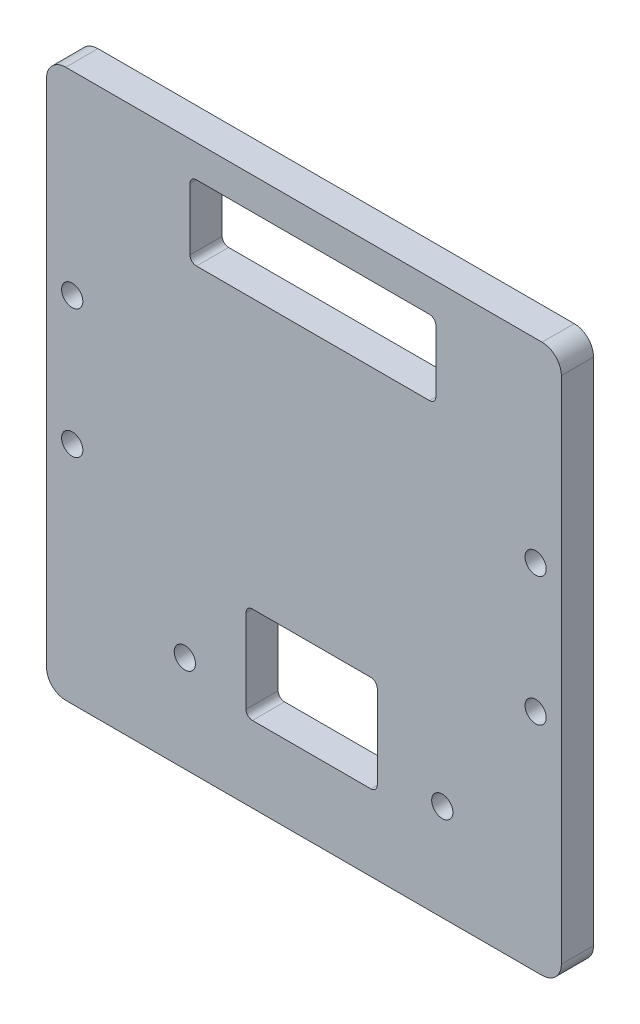
ISO-10303-21;
HEADER;
FILE_DESCRIPTION(('STEP AP214'),'2;1');
FILE_NAME('part.step','',(''),(''),'','','');
FILE_SCHEMA(('AUTOMOTIVE_DESIGN { 1 0 10303 214 1 1 1 1 }'));
ENDSEC;
DATA;
#1=APPLICATION_CONTEXT('core data for automotive mechanical design processes');
#2=APPLICATION_PROTOCOL_DEFINITION('international standard','automotive_design',2000,#1);
#3=PRODUCT_CONTEXT('',#1,'mechanical');
#4=PRODUCT('Part','Part','',(#3));
#5=PRODUCT_RELATED_PRODUCT_CATEGORY('part','',(#4));
#6=PRODUCT_DEFINITION_FORMATION('','',#4);
#7=PRODUCT_DEFINITION_CONTEXT('part definition',#1,'design');
#8=PRODUCT_DEFINITION('design','',#6,#7);
#9=PRODUCT_DEFINITION_SHAPE('','',#8);
#10=(LENGTH_UNIT() NAMED_UNIT(*) SI_UNIT(.MILLI.,.METRE.));
#11=(NAMED_UNIT(*) PLANE_ANGLE_UNIT() SI_UNIT($,.RADIAN.));
#12=(NAMED_UNIT(*) SI_UNIT($,.STERADIAN.) SOLID_ANGLE_UNIT());
#13=UNCERTAINTY_MEASURE_WITH_UNIT(LENGTH_MEASURE(1.E-05),#10,'distance_accuracy_value','');
#14=(GEOMETRIC_REPRESENTATION_CONTEXT(3) GLOBAL_UNCERTAINTY_ASSIGNED_CONTEXT((#13)) GLOBAL_UNIT_ASSIGNED_CONTEXT((#10,
#11,#12)) REPRESENTATION_CONTEXT('',''));
#15=CARTESIAN_POINT('',(0.,0.,0.));
#16=DIRECTION('',(0.,0.,1.));
#17=DIRECTION('',(1.,0.,0.));
#18=AXIS2_PLACEMENT_3D('',#15,#16,#17);
#19=CARTESIAN_POINT('',(0.,0.,43.4989056307904));
#20=DIRECTION('',(0.,0.,1.));
#21=DIRECTION('',(1.,0.,0.));
#22=AXIS2_PLACEMENT_3D('',#19,#20,#21);
#23=PLANE('',#22);
#24=CARTESIAN_POINT('',(16.7989221606857,40.7225688335815,43.4989056307904));
#25=DIRECTION('',(0.,0.,1.));
#26=DIRECTION('',(1.,0.,0.));
#27=AXIS2_PLACEMENT_3D('',#24,#25,#26);
#28=CIRCLE('',#27,1.65);
#29=CARTESIAN_POINT('',(18.4489221606857,40.7225688335815,43.4989056307904));
#30=VERTEX_POINT('',#29);
#31=EDGE_CURVE('E833',#30,#30,#28,.T.);
#32=ORIENTED_EDGE('',*,*,#31,.F.);
#33=EDGE_LOOP('',(#32));
#34=FACE_BOUND('',#33,.T.);
#35=CARTESIAN_POINT('',(-37.7010778393143,20.7225688335815,43.4989056307904));
#36=DIRECTION('',(0.,0.,1.));
#37=DIRECTION('',(1.,0.,0.));
#38=AXIS2_PLACEMENT_3D('',#35,#36,#37);
#39=CIRCLE('',#38,1.65);
#40=CARTESIAN_POINT('',(-36.0510778393143,20.7225688335815,43.4989056307904));
#41=VERTEX_POINT('',#40);
#42=EDGE_CURVE('E817',#41,#41,#39,.T.);
#43=ORIENTED_EDGE('',*,*,#42,.F.);
#44=EDGE_LOOP('',(#43));
#45=FACE_BOUND('',#44,.T.);
#46=CARTESIAN_POINT('',(-55.2010778393143,60.7225688335815,43.4989056307904));
#47=DIRECTION('',(0.,0.,1.));
#48=DIRECTION('',(1.,0.,0.));
#49=AXIS2_PLACEMENT_3D('',#46,#47,#48);
#50=CIRCLE('',#49,1.65);
#51=CARTESIAN_POINT('',(-53.5510778393143,60.7225688335815,43.4989056307904));
#52=VERTEX_POINT('',#51);
#53=EDGE_CURVE('E427',#52,#52,#50,.T.);
#54=ORIENTED_EDGE('',*,*,#53,.F.);
#55=EDGE_LOOP('',(#54));
#56=FACE_BOUND('',#55,.T.);
#57=DIRECTION('',(-1.,0.,0.));
#58=VECTOR('',#57,1.);
#59=CARTESIAN_POINT('',(-59.2010778393143,90.9225688335816,43.4989056307904));
#60=LINE('',#59,#58);
#61=CARTESIAN_POINT('',(17.7989221606857,90.9225688335816,43.4989056307904));
#62=VERTEX_POINT('',#61);
#63=CARTESIAN_POINT('',(-56.2010778393143,90.9225688335816,43.4989056307904));
#64=VERTEX_POINT('',#63);
#65=EDGE_CURVE('E245',#62,#64,#60,.T.);
#66=ORIENTED_EDGE('',*,*,#65,.T.);
#67=CARTESIAN_POINT('',(-56.2010778393143,87.9225688335816,43.4989056307904));
#68=DIRECTION('',(0.,0.,1.));
#69=DIRECTION('',(1.,0.,0.));
#70=AXIS2_PLACEMENT_3D('',#67,#68,#69);
#71=CIRCLE('',#70,3.);
#72=CARTESIAN_POINT('',(-59.2010778393143,87.9225688335816,43.4989056307904));
#73=VERTEX_POINT('',#72);
#74=EDGE_CURVE('E277',#64,#73,#71,.T.);
#75=ORIENTED_EDGE('',*,*,#74,.T.);
#76=DIRECTION('',(0.,-1.,0.));
#77=VECTOR('',#76,1.);
#78=CARTESIAN_POINT('',(-59.2010778393143,90.9225688335816,43.4989056307904));
#79=LINE('',#78,#77);
#80=CARTESIAN_POINT('',(-59.2010778393143,8.72256883358154,43.4989056307904));
#81=VERTEX_POINT('',#80);
#82=EDGE_CURVE('E224',#73,#81,#79,.T.);
#83=ORIENTED_EDGE('',*,*,#82,.T.);
#84=CARTESIAN_POINT('',(-56.2010778393143,8.72256883358153,43.4989056307904));
#85=DIRECTION('',(0.,0.,1.));
#86=DIRECTION('',(1.,0.,0.));
#87=AXIS2_PLACEMENT_3D('',#84,#85,#86);
#88=CIRCLE('',#87,3.);
#89=CARTESIAN_POINT('',(-56.2010778393143,5.72256883358153,43.4989056307904));
#90=VERTEX_POINT('',#89);
#91=EDGE_CURVE('E274',#81,#90,#88,.T.);
#92=ORIENTED_EDGE('',*,*,#91,.T.);
#93=DIRECTION('',(1.,0.,0.));
#94=VECTOR('',#93,1.);
#95=CARTESIAN_POINT('',(-59.2010778393143,5.72256883358153,43.4989056307904));
#96=LINE('',#95,#94);
#97=CARTESIAN_POINT('',(17.7989221606857,5.72256883358153,43.4989056307904));
#98=VERTEX_POINT('',#97);
#99=EDGE_CURVE('E461',#90,#98,#96,.T.);
#100=ORIENTED_EDGE('',*,*,#99,.T.);
#101=CARTESIAN_POINT('',(17.7989221606857,8.72256883358154,43.4989056307904));
#102=DIRECTION('',(0.,0.,1.));
#103=DIRECTION('',(1.,0.,0.));
#104=AXIS2_PLACEMENT_3D('',#101,#102,#103);
#105=CIRCLE('',#104,3.);
#106=CARTESIAN_POINT('',(20.7989221606857,8.72256883358154,43.4989056307904));
#107=VERTEX_POINT('',#106);
#108=EDGE_CURVE('E271',#98,#107,#105,.T.);
#109=ORIENTED_EDGE('',*,*,#108,.T.);
#110=DIRECTION('',(0.,1.,0.));
#111=VECTOR('',#110,1.);
#112=CARTESIAN_POINT('',(20.7989221606857,90.9225688335816,43.4989056307904));
#113=LINE('',#112,#111);
#114=CARTESIAN_POINT('',(20.7989221606857,87.9225688335816,43.4989056307904));
#115=VERTEX_POINT('',#114);
#116=EDGE_CURVE('E464',#107,#115,#113,.T.);
#117=ORIENTED_EDGE('',*,*,#116,.T.);
#118=CARTESIAN_POINT('',(17.7989221606857,87.9225688335816,43.4989056307904));
#119=DIRECTION('',(0.,0.,1.));
#120=DIRECTION('',(1.,0.,0.));
#121=AXIS2_PLACEMENT_3D('',#118,#119,#120);
#122=CIRCLE('',#121,3.);
#123=EDGE_CURVE('E268',#115,#62,#122,.T.);
#124=ORIENTED_EDGE('',*,*,#123,.T.);
#125=EDGE_LOOP('',(#66,#75,#83,#92,#100,#109,#117,#124));
#126=FACE_BOUND('',#125,.T.);
#127=DIRECTION('',(1.,0.,0.));
#128=VECTOR('',#127,1.);
#129=CARTESIAN_POINT('',(-28.2010778393143,17.5225688335815,43.4989056307904));
#130=LINE('',#129,#128);
#131=CARTESIAN_POINT('',(-27.2010778393143,17.5225688335815,43.4989056307904));
#132=VERTEX_POINT('',#131);
#133=CARTESIAN_POINT('',(-8.8010778393143,17.5225688335815,43.4989056307904));
#134=VERTEX_POINT('',#133);
#135=EDGE_CURVE('E437',#132,#134,#130,.T.);
#136=ORIENTED_EDGE('',*,*,#135,.F.);
#137=CARTESIAN_POINT('',(-27.2010778393143,18.5225688335815,43.4989056307904));
#138=DIRECTION('',(0.,0.,1.));
#139=DIRECTION('',(1.,0.,0.));
#140=AXIS2_PLACEMENT_3D('',#137,#138,#139);
#141=CIRCLE('',#140,1.);
#142=CARTESIAN_POINT('',(-28.2010778393143,18.5225688335815,43.4989056307904));
#143=VERTEX_POINT('',#142);
#144=EDGE_CURVE('E352',#132,#143,#141,.F.);
#145=ORIENTED_EDGE('',*,*,#144,.T.);
#146=DIRECTION('',(0.,-1.,0.));
#147=VECTOR('',#146,1.);
#148=CARTESIAN_POINT('',(-28.2010778393143,32.5225688335815,43.4989056307904));
#149=LINE('',#148,#147);
#150=CARTESIAN_POINT('',(-28.2010778393143,31.5225688335815,43.4989056307904));
#151=VERTEX_POINT('',#150);
#152=EDGE_CURVE('E433',#151,#143,#149,.T.);
#153=ORIENTED_EDGE('',*,*,#152,.F.);
#154=CARTESIAN_POINT('',(-27.2010778393143,31.5225688335815,43.4989056307904));
#155=DIRECTION('',(0.,0.,1.));
#156=DIRECTION('',(1.,0.,0.));
#157=AXIS2_PLACEMENT_3D('',#154,#155,#156);
#158=CIRCLE('',#157,1.);
#159=CARTESIAN_POINT('',(-27.2010778393143,32.5225688335815,43.4989056307904));
#160=VERTEX_POINT('',#159);
#161=EDGE_CURVE('E370',#151,#160,#158,.F.);
#162=ORIENTED_EDGE('',*,*,#161,.T.);
#163=DIRECTION('',(-1.,0.,0.));
#164=VECTOR('',#163,1.);
#165=CARTESIAN_POINT('',(-28.2010778393143,32.5225688335815,43.4989056307904));
#166=LINE('',#165,#164);
#167=CARTESIAN_POINT('',(-8.8010778393143,32.5225688335815,43.4989056307904));
#168=VERTEX_POINT('',#167);
#169=EDGE_CURVE('E234',#168,#160,#166,.T.);
#170=ORIENTED_EDGE('',*,*,#169,.F.);
#171=CARTESIAN_POINT('',(-8.8010778393143,31.5225688335815,43.4989056307904));
#172=DIRECTION('',(0.,0.,1.));
#173=DIRECTION('',(1.,0.,0.));
#174=AXIS2_PLACEMENT_3D('',#171,#172,#173);
#175=CIRCLE('',#174,1.);
#176=CARTESIAN_POINT('',(-7.80107783931429,31.5225688335815,43.4989056307904));
#177=VERTEX_POINT('',#176);
#178=EDGE_CURVE('E364',#168,#177,#175,.F.);
#179=ORIENTED_EDGE('',*,*,#178,.T.);
#180=DIRECTION('',(0.,1.,0.));
#181=VECTOR('',#180,1.);
#182=CARTESIAN_POINT('',(-7.80107783931429,32.5225688335815,43.4989056307904));
#183=LINE('',#182,#181);
#184=CARTESIAN_POINT('',(-7.80107783931429,18.5225688335815,43.4989056307904));
#185=VERTEX_POINT('',#184);
#186=EDGE_CURVE('E242',#185,#177,#183,.T.);
#187=ORIENTED_EDGE('',*,*,#186,.F.);
#188=CARTESIAN_POINT('',(-8.8010778393143,18.5225688335815,43.4989056307904));
#189=DIRECTION('',(0.,0.,1.));
#190=DIRECTION('',(1.,0.,0.));
#191=AXIS2_PLACEMENT_3D('',#188,#189,#190);
#192=CIRCLE('',#191,1.);
#193=EDGE_CURVE('E358',#185,#134,#192,.F.);
#194=ORIENTED_EDGE('',*,*,#193,.T.);
#195=EDGE_LOOP('',(#136,#145,#153,#162,#170,#179,#187,#194));
#196=FACE_BOUND('',#195,.T.);
#197=DIRECTION('',(1.,0.,0.));
#198=VECTOR('',#197,1.);
#199=CARTESIAN_POINT('',(-36.9010778393143,74.3225688335816,43.4989056307904));
#200=LINE('',#199,#198);
#201=CARTESIAN_POINT('',(-35.9010778393143,74.3225688335816,43.4989056307904));
#202=VERTEX_POINT('',#201);
#203=CARTESIAN_POINT('',(0.298922160685701,74.3225688335816,43.4989056307904));
#204=VERTEX_POINT('',#203);
#205=EDGE_CURVE('E412',#202,#204,#200,.T.);
#206=ORIENTED_EDGE('',*,*,#205,.F.);
#207=CARTESIAN_POINT('',(-35.9010778393143,75.3225688335816,43.4989056307904));
#208=DIRECTION('',(0.,0.,1.));
#209=DIRECTION('',(1.,0.,0.));
#210=AXIS2_PLACEMENT_3D('',#207,#208,#209);
#211=CIRCLE('',#210,1.);
#212=CARTESIAN_POINT('',(-36.9010778393143,75.3225688335816,43.4989056307904));
#213=VERTEX_POINT('',#212);
#214=EDGE_CURVE('E382',#202,#213,#211,.F.);
#215=ORIENTED_EDGE('',*,*,#214,.T.);
#216=DIRECTION('',(0.,-1.,0.));
#217=VECTOR('',#216,1.);
#218=CARTESIAN_POINT('',(-36.9010778393143,85.9225688335815,43.4989056307904));
#219=LINE('',#218,#217);
#220=CARTESIAN_POINT('',(-36.9010778393143,84.9225688335815,43.4989056307904));
#221=VERTEX_POINT('',#220);
#222=EDGE_CURVE('E405',#221,#213,#219,.T.);
#223=ORIENTED_EDGE('',*,*,#222,.F.);
#224=CARTESIAN_POINT('',(-35.9010778393143,84.9225688335815,43.4989056307904));
#225=DIRECTION('',(0.,0.,1.));
#226=DIRECTION('',(1.,0.,0.));
#227=AXIS2_PLACEMENT_3D('',#224,#225,#226);
#228=CIRCLE('',#227,1.);
#229=CARTESIAN_POINT('',(-35.9010778393143,85.9225688335815,43.4989056307904));
#230=VERTEX_POINT('',#229);
#231=EDGE_CURVE('E376',#221,#230,#228,.F.);
#232=ORIENTED_EDGE('',*,*,#231,.T.);
#233=DIRECTION('',(-1.,0.,0.));
#234=VECTOR('',#233,1.);
#235=CARTESIAN_POINT('',(-36.9010778393143,85.9225688335815,43.4989056307904));
#236=LINE('',#235,#234);
#237=CARTESIAN_POINT('',(0.298922160685694,85.9225688335816,43.4989056307904));
#238=VERTEX_POINT('',#237);
#239=EDGE_CURVE('E411',#238,#230,#236,.T.);
#240=ORIENTED_EDGE('',*,*,#239,.F.);
#241=CARTESIAN_POINT('',(0.298922160685695,84.9225688335816,43.4989056307904));
#242=DIRECTION('',(0.,0.,1.));
#243=DIRECTION('',(1.,0.,0.));
#244=AXIS2_PLACEMENT_3D('',#241,#242,#243);
#245=CIRCLE('',#244,1.);
#246=CARTESIAN_POINT('',(1.2989221606857,84.9225688335816,43.4989056307904));
#247=VERTEX_POINT('',#246);
#248=EDGE_CURVE('E11',#238,#247,#245,.F.);
#249=ORIENTED_EDGE('',*,*,#248,.T.);
#250=DIRECTION('',(0.,1.,0.));
#251=VECTOR('',#250,1.);
#252=CARTESIAN_POINT('',(1.29892216068569,85.9225688335816,43.4989056307904));
#253=LINE('',#252,#251);
#254=CARTESIAN_POINT('',(1.2989221606857,75.3225688335816,43.4989056307904));
#255=VERTEX_POINT('',#254);
#256=EDGE_CURVE('E408',#255,#247,#253,.T.);
#257=ORIENTED_EDGE('',*,*,#256,.F.);
#258=CARTESIAN_POINT('',(0.298922160685701,75.3225688335816,43.4989056307904));
#259=DIRECTION('',(0.,0.,1.));
#260=DIRECTION('',(1.,0.,0.));
#261=AXIS2_PLACEMENT_3D('',#258,#259,#260);
#262=CIRCLE('',#261,1.);
#263=EDGE_CURVE('E388',#255,#204,#262,.F.);
#264=ORIENTED_EDGE('',*,*,#263,.T.);
#265=EDGE_LOOP('',(#206,#215,#223,#232,#240,#249,#257,#264));
#266=FACE_BOUND('',#265,.T.);
#267=CARTESIAN_POINT('',(-55.2010778393143,40.7225688335815,43.4989056307904));
#268=DIRECTION('',(0.,0.,1.));
#269=DIRECTION('',(1.,0.,0.));
#270=AXIS2_PLACEMENT_3D('',#267,#268,#269);
#271=CIRCLE('',#270,1.65);
#272=CARTESIAN_POINT('',(-53.5510778393143,40.7225688335815,43.4989056307904));
#273=VERTEX_POINT('',#272);
#274=EDGE_CURVE('E809',#273,#273,#271,.T.);
#275=ORIENTED_EDGE('',*,*,#274,.F.);
#276=EDGE_LOOP('',(#275));
#277=FACE_BOUND('',#276,.T.);
#278=CARTESIAN_POINT('',(2.2989221606857,20.7225688335815,43.4989056307904));
#279=DIRECTION('',(0.,0.,1.));
#280=DIRECTION('',(1.,0.,0.));
#281=AXIS2_PLACEMENT_3D('',#278,#279,#280);
#282=CIRCLE('',#281,1.65);
#283=CARTESIAN_POINT('',(3.9489221606857,20.7225688335815,43.4989056307904));
#284=VERTEX_POINT('',#283);
#285=EDGE_CURVE('E825',#284,#284,#282,.T.);
#286=ORIENTED_EDGE('',*,*,#285,.F.);
#287=EDGE_LOOP('',(#286));
#288=FACE_BOUND('',#287,.T.);
#289=CARTESIAN_POINT('',(16.7989221606857,60.7225688335815,43.4989056307904));
#290=DIRECTION('',(0.,0.,1.));
#291=DIRECTION('',(1.,0.,0.));
#292=AXIS2_PLACEMENT_3D('',#289,#290,#291);
#293=CIRCLE('',#292,1.65);
#294=CARTESIAN_POINT('',(18.4489221606857,60.7225688335815,43.4989056307904));
#295=VERTEX_POINT('',#294);
#296=EDGE_CURVE('E841',#295,#295,#293,.T.);
#297=ORIENTED_EDGE('',*,*,#296,.F.);
#298=EDGE_LOOP('',(#297));
#299=FACE_BOUND('',#298,.T.);
#300=ADVANCED_FACE('F41',(#34,#45,#56,#126,#196,#266,#277,#288,#299),#23,.T.);
#301=CARTESIAN_POINT('',(0.,0.,38.4989056307904));
#302=DIRECTION('',(0.,0.,1.));
#303=DIRECTION('',(1.,0.,0.));
#304=AXIS2_PLACEMENT_3D('',#301,#302,#303);
#305=PLANE('',#304);
#306=DIRECTION('',(-1.,0.,0.));
#307=VECTOR('',#306,1.);
#308=CARTESIAN_POINT('',(-28.2010778393143,32.5225688335815,38.4989056307904));
#309=LINE('',#308,#307);
#310=CARTESIAN_POINT('',(-8.8010778393143,32.5225688335815,38.4989056307904));
#311=VERTEX_POINT('',#310);
#312=CARTESIAN_POINT('',(-27.2010778393143,32.5225688335815,38.4989056307904));
#313=VERTEX_POINT('',#312);
#314=EDGE_CURVE('E438',#311,#313,#309,.T.);
#315=ORIENTED_EDGE('',*,*,#314,.T.);
#316=CARTESIAN_POINT('',(-27.2010778393143,31.5225688335815,38.4989056307904));
#317=DIRECTION('',(0.,0.,1.));
#318=DIRECTION('',(1.,0.,0.));
#319=AXIS2_PLACEMENT_3D('',#316,#317,#318);
#320=CIRCLE('',#319,1.);
#321=CARTESIAN_POINT('',(-28.2010778393143,31.5225688335815,38.4989056307904));
#322=VERTEX_POINT('',#321);
#323=EDGE_CURVE('E367',#313,#322,#320,.T.);
#324=ORIENTED_EDGE('',*,*,#323,.T.);
#325=DIRECTION('',(0.,-1.,0.));
#326=VECTOR('',#325,1.);
#327=CARTESIAN_POINT('',(-28.2010778393143,32.5225688335815,38.4989056307904));
#328=LINE('',#327,#326);
#329=CARTESIAN_POINT('',(-28.2010778393143,18.5225688335815,38.4989056307904));
#330=VERTEX_POINT('',#329);
#331=EDGE_CURVE('E416',#322,#330,#328,.T.);
#332=ORIENTED_EDGE('',*,*,#331,.T.);
#333=CARTESIAN_POINT('',(-27.2010778393143,18.5225688335815,38.4989056307904));
#334=DIRECTION('',(0.,0.,1.));
#335=DIRECTION('',(1.,0.,0.));
#336=AXIS2_PLACEMENT_3D('',#333,#334,#335);
#337=CIRCLE('',#336,1.);
#338=CARTESIAN_POINT('',(-27.2010778393143,17.5225688335815,38.4989056307904));
#339=VERTEX_POINT('',#338);
#340=EDGE_CURVE('E349',#330,#339,#337,.T.);
#341=ORIENTED_EDGE('',*,*,#340,.T.);
#342=DIRECTION('',(1.,0.,0.));
#343=VECTOR('',#342,1.);
#344=CARTESIAN_POINT('',(-28.2010778393143,17.5225688335815,38.4989056307904));
#345=LINE('',#344,#343);
#346=CARTESIAN_POINT('',(-8.8010778393143,17.5225688335815,38.4989056307904));
#347=VERTEX_POINT('',#346);
#348=EDGE_CURVE('E448',#339,#347,#345,.T.);
#349=ORIENTED_EDGE('',*,*,#348,.T.);
#350=CARTESIAN_POINT('',(-8.8010778393143,18.5225688335815,38.4989056307904));
#351=DIRECTION('',(0.,0.,1.));
#352=DIRECTION('',(1.,0.,0.));
#353=AXIS2_PLACEMENT_3D('',#350,#351,#352);
#354=CIRCLE('',#353,1.);
#355=CARTESIAN_POINT('',(-7.80107783931429,18.5225688335815,38.4989056307904));
#356=VERTEX_POINT('',#355);
#357=EDGE_CURVE('E355',#347,#356,#354,.T.);
#358=ORIENTED_EDGE('',*,*,#357,.T.);
#359=DIRECTION('',(0.,1.,0.));
#360=VECTOR('',#359,1.);
#361=CARTESIAN_POINT('',(-7.80107783931429,32.5225688335815,38.4989056307904));
#362=LINE('',#361,#360);
#363=CARTESIAN_POINT('',(-7.80107783931429,31.5225688335815,38.4989056307904));
#364=VERTEX_POINT('',#363);
#365=EDGE_CURVE('E452',#356,#364,#362,.T.);
#366=ORIENTED_EDGE('',*,*,#365,.T.);
#367=CARTESIAN_POINT('',(-8.8010778393143,31.5225688335815,38.4989056307904));
#368=DIRECTION('',(0.,0.,1.));
#369=DIRECTION('',(1.,0.,0.));
#370=AXIS2_PLACEMENT_3D('',#367,#368,#369);
#371=CIRCLE('',#370,1.);
#372=EDGE_CURVE('E361',#364,#311,#371,.T.);
#373=ORIENTED_EDGE('',*,*,#372,.T.);
#374=EDGE_LOOP('',(#315,#324,#332,#341,#349,#358,#366,#373));
#375=FACE_BOUND('',#374,.T.);
#376=DIRECTION('',(0.,-1.,0.));
#377=VECTOR('',#376,1.);
#378=CARTESIAN_POINT('',(-59.2010778393143,90.9225688335816,38.4989056307904));
#379=LINE('',#378,#377);
#380=CARTESIAN_POINT('',(-59.2010778393143,87.9225688335816,38.4989056307904));
#381=VERTEX_POINT('',#380);
#382=CARTESIAN_POINT('',(-59.2010778393143,8.72256883358154,38.4989056307904));
#383=VERTEX_POINT('',#382);
#384=EDGE_CURVE('E221',#381,#383,#379,.T.);
#385=ORIENTED_EDGE('',*,*,#384,.F.);
#386=CARTESIAN_POINT('',(-56.2010778393143,87.9225688335816,38.4989056307904));
#387=DIRECTION('',(0.,0.,1.));
#388=DIRECTION('',(1.,0.,0.));
#389=AXIS2_PLACEMENT_3D('',#386,#387,#388);
#390=CIRCLE('',#389,3.);
#391=CARTESIAN_POINT('',(-56.2010778393143,90.9225688335816,38.4989056307904));
#392=VERTEX_POINT('',#391);
#393=EDGE_CURVE('E203',#381,#392,#390,.F.);
#394=ORIENTED_EDGE('',*,*,#393,.T.);
#395=DIRECTION('',(-1.,0.,0.));
#396=VECTOR('',#395,1.);
#397=CARTESIAN_POINT('',(-59.2010778393143,90.9225688335816,38.4989056307904));
#398=LINE('',#397,#396);
#399=CARTESIAN_POINT('',(17.7989221606857,90.9225688335816,38.4989056307904));
#400=VERTEX_POINT('',#399);
#401=EDGE_CURVE('E251',#400,#392,#398,.T.);
#402=ORIENTED_EDGE('',*,*,#401,.F.);
#403=CARTESIAN_POINT('',(17.7989221606857,87.9225688335816,38.4989056307904));
#404=DIRECTION('',(0.,0.,1.));
#405=DIRECTION('',(1.,0.,0.));
#406=AXIS2_PLACEMENT_3D('',#403,#404,#405);
#407=CIRCLE('',#406,3.);
#408=CARTESIAN_POINT('',(20.7989221606857,87.9225688335816,38.4989056307904));
#409=VERTEX_POINT('',#408);
#410=EDGE_CURVE('E226',#400,#409,#407,.F.);
#411=ORIENTED_EDGE('',*,*,#410,.T.);
#412=DIRECTION('',(0.,1.,0.));
#413=VECTOR('',#412,1.);
#414=CARTESIAN_POINT('',(20.7989221606857,90.9225688335816,38.4989056307904));
#415=LINE('',#414,#413);
#416=CARTESIAN_POINT('',(20.7989221606857,8.72256883358154,38.4989056307904));
#417=VERTEX_POINT('',#416);
#418=EDGE_CURVE('E239',#417,#409,#415,.T.);
#419=ORIENTED_EDGE('',*,*,#418,.F.);
#420=CARTESIAN_POINT('',(17.7989221606857,8.72256883358154,38.4989056307904));
#421=DIRECTION('',(0.,0.,1.));
#422=DIRECTION('',(1.,0.,0.));
#423=AXIS2_PLACEMENT_3D('',#420,#421,#422);
#424=CIRCLE('',#423,3.);
#425=CARTESIAN_POINT('',(17.7989221606857,5.72256883358153,38.4989056307904));
#426=VERTEX_POINT('',#425);
#427=EDGE_CURVE('E258',#417,#426,#424,.F.);
#428=ORIENTED_EDGE('',*,*,#427,.T.);
#429=DIRECTION('',(1.,0.,0.));
#430=VECTOR('',#429,1.);
#431=CARTESIAN_POINT('',(-59.2010778393143,5.72256883358153,38.4989056307904));
#432=LINE('',#431,#430);
#433=CARTESIAN_POINT('',(-56.2010778393143,5.72256883358153,38.4989056307904));
#434=VERTEX_POINT('',#433);
#435=EDGE_CURVE('E233',#434,#426,#432,.T.);
#436=ORIENTED_EDGE('',*,*,#435,.F.);
#437=CARTESIAN_POINT('',(-56.2010778393143,8.72256883358153,38.4989056307904));
#438=DIRECTION('',(0.,0.,1.));
#439=DIRECTION('',(1.,0.,0.));
#440=AXIS2_PLACEMENT_3D('',#437,#438,#439);
#441=CIRCLE('',#440,3.);
#442=EDGE_CURVE('E215',#434,#383,#441,.F.);
#443=ORIENTED_EDGE('',*,*,#442,.T.);
#444=EDGE_LOOP('',(#385,#394,#402,#411,#419,#428,#436,#443));
#445=FACE_BOUND('',#444,.T.);
#446=DIRECTION('',(-1.,0.,0.));
#447=VECTOR('',#446,1.);
#448=CARTESIAN_POINT('',(-36.9010778393143,85.9225688335815,38.4989056307904));
#449=LINE('',#448,#447);
#450=CARTESIAN_POINT('',(0.298922160685694,85.9225688335816,38.4989056307904));
#451=VERTEX_POINT('',#450);
#452=CARTESIAN_POINT('',(-35.9010778393143,85.9225688335815,38.4989056307904));
#453=VERTEX_POINT('',#452);
#454=EDGE_CURVE('E395',#451,#453,#449,.T.);
#455=ORIENTED_EDGE('',*,*,#454,.T.);
#456=CARTESIAN_POINT('',(-35.9010778393143,84.9225688335815,38.4989056307904));
#457=DIRECTION('',(0.,0.,1.));
#458=DIRECTION('',(1.,0.,0.));
#459=AXIS2_PLACEMENT_3D('',#456,#457,#458);
#460=CIRCLE('',#459,1.);
#461=CARTESIAN_POINT('',(-36.9010778393143,84.9225688335815,38.4989056307904));
#462=VERTEX_POINT('',#461);
#463=EDGE_CURVE('E373',#453,#462,#460,.T.);
#464=ORIENTED_EDGE('',*,*,#463,.T.);
#465=DIRECTION('',(0.,-1.,0.));
#466=VECTOR('',#465,1.);
#467=CARTESIAN_POINT('',(-36.9010778393143,85.9225688335815,38.4989056307904));
#468=LINE('',#467,#466);
#469=CARTESIAN_POINT('',(-36.9010778393143,75.3225688335816,38.4989056307904));
#470=VERTEX_POINT('',#469);
#471=EDGE_CURVE('E422',#462,#470,#468,.T.);
#472=ORIENTED_EDGE('',*,*,#471,.T.);
#473=CARTESIAN_POINT('',(-35.9010778393143,75.3225688335816,38.4989056307904));
#474=DIRECTION('',(0.,0.,1.));
#475=DIRECTION('',(1.,0.,0.));
#476=AXIS2_PLACEMENT_3D('',#473,#474,#475);
#477=CIRCLE('',#476,1.);
#478=CARTESIAN_POINT('',(-35.9010778393143,74.3225688335816,38.4989056307904));
#479=VERTEX_POINT('',#478);
#480=EDGE_CURVE('E379',#470,#479,#477,.T.);
#481=ORIENTED_EDGE('',*,*,#480,.T.);
#482=DIRECTION('',(1.,0.,0.));
#483=VECTOR('',#482,1.);
#484=CARTESIAN_POINT('',(-36.9010778393143,74.3225688335816,38.4989056307904));
#485=LINE('',#484,#483);
#486=CARTESIAN_POINT('',(0.298922160685701,74.3225688335816,38.4989056307904));
#487=VERTEX_POINT('',#486);
#488=EDGE_CURVE('E426',#479,#487,#485,.T.);
#489=ORIENTED_EDGE('',*,*,#488,.T.);
#490=CARTESIAN_POINT('',(0.298922160685701,75.3225688335816,38.4989056307904));
#491=DIRECTION('',(0.,0.,1.));
#492=DIRECTION('',(1.,0.,0.));
#493=AXIS2_PLACEMENT_3D('',#490,#491,#492);
#494=CIRCLE('',#493,1.);
#495=CARTESIAN_POINT('',(1.2989221606857,75.3225688335816,38.4989056307904));
#496=VERTEX_POINT('',#495);
#497=EDGE_CURVE('E385',#487,#496,#494,.T.);
#498=ORIENTED_EDGE('',*,*,#497,.T.);
#499=DIRECTION('',(0.,1.,0.));
#500=VECTOR('',#499,1.);
#501=CARTESIAN_POINT('',(1.29892216068569,85.9225688335816,38.4989056307904));
#502=LINE('',#501,#500);
#503=CARTESIAN_POINT('',(1.2989221606857,84.9225688335816,38.4989056307904));
#504=VERTEX_POINT('',#503);
#505=EDGE_CURVE('E396',#496,#504,#502,.T.);
#506=ORIENTED_EDGE('',*,*,#505,.T.);
#507=CARTESIAN_POINT('',(0.298922160685695,84.9225688335816,38.4989056307904));
#508=DIRECTION('',(0.,0.,1.));
#509=DIRECTION('',(1.,0.,0.));
#510=AXIS2_PLACEMENT_3D('',#507,#508,#509);
#511=CIRCLE('',#510,1.);
#512=EDGE_CURVE('E50',#504,#451,#511,.T.);
#513=ORIENTED_EDGE('',*,*,#512,.T.);
#514=EDGE_LOOP('',(#455,#464,#472,#481,#489,#498,#506,#513));
#515=FACE_BOUND('',#514,.T.);
#516=CARTESIAN_POINT('',(-55.2010778393143,60.7225688335815,38.4989056307904));
#517=DIRECTION('',(0.,0.,1.));
#518=DIRECTION('',(1.,0.,0.));
#519=AXIS2_PLACEMENT_3D('',#516,#517,#518);
#520=CIRCLE('',#519,1.65);
#521=CARTESIAN_POINT('',(-53.5510778393143,60.7225688335815,38.4989056307904));
#522=VERTEX_POINT('',#521);
#523=EDGE_CURVE('E805',#522,#522,#520,.T.);
#524=ORIENTED_EDGE('',*,*,#523,.T.);
#525=EDGE_LOOP('',(#524));
#526=FACE_BOUND('',#525,.T.);
#527=CARTESIAN_POINT('',(-55.2010778393143,40.7225688335815,38.4989056307904));
#528=DIRECTION('',(0.,0.,1.));
#529=DIRECTION('',(1.,0.,0.));
#530=AXIS2_PLACEMENT_3D('',#527,#528,#529);
#531=CIRCLE('',#530,1.65);
#532=CARTESIAN_POINT('',(-53.5510778393143,40.7225688335815,38.4989056307904));
#533=VERTEX_POINT('',#532);
#534=EDGE_CURVE('E813',#533,#533,#531,.T.);
#535=ORIENTED_EDGE('',*,*,#534,.T.);
#536=EDGE_LOOP('',(#535));
#537=FACE_BOUND('',#536,.T.);
#538=CARTESIAN_POINT('',(-37.7010778393143,20.7225688335815,38.4989056307904));
#539=DIRECTION('',(0.,0.,1.));
#540=DIRECTION('',(1.,0.,0.));
#541=AXIS2_PLACEMENT_3D('',#538,#539,#540);
#542=CIRCLE('',#541,1.65);
#543=CARTESIAN_POINT('',(-36.0510778393143,20.7225688335815,38.4989056307904));
#544=VERTEX_POINT('',#543);
#545=EDGE_CURVE('E821',#544,#544,#542,.T.);
#546=ORIENTED_EDGE('',*,*,#545,.T.);
#547=EDGE_LOOP('',(#546));
#548=FACE_BOUND('',#547,.T.);
#549=CARTESIAN_POINT('',(2.2989221606857,20.7225688335815,38.4989056307904));
#550=DIRECTION('',(0.,0.,1.));
#551=DIRECTION('',(1.,0.,0.));
#552=AXIS2_PLACEMENT_3D('',#549,#550,#551);
#553=CIRCLE('',#552,1.65);
#554=CARTESIAN_POINT('',(3.9489221606857,20.7225688335815,38.4989056307904));
#555=VERTEX_POINT('',#554);
#556=EDGE_CURVE('E829',#555,#555,#553,.T.);
#557=ORIENTED_EDGE('',*,*,#556,.T.);
#558=EDGE_LOOP('',(#557));
#559=FACE_BOUND('',#558,.T.);
#560=CARTESIAN_POINT('',(16.7989221606857,40.7225688335815,38.4989056307904));
#561=DIRECTION('',(0.,0.,1.));
#562=DIRECTION('',(1.,0.,0.));
#563=AXIS2_PLACEMENT_3D('',#560,#561,#562);
#564=CIRCLE('',#563,1.65);
#565=CARTESIAN_POINT('',(18.4489221606857,40.7225688335815,38.4989056307904));
#566=VERTEX_POINT('',#565);
#567=EDGE_CURVE('E837',#566,#566,#564,.T.);
#568=ORIENTED_EDGE('',*,*,#567,.T.);
#569=EDGE_LOOP('',(#568));
#570=FACE_BOUND('',#569,.T.);
#571=CARTESIAN_POINT('',(16.7989221606857,60.7225688335815,38.4989056307904));
#572=DIRECTION('',(0.,0.,1.));
#573=DIRECTION('',(1.,0.,0.));
#574=AXIS2_PLACEMENT_3D('',#571,#572,#573);
#575=CIRCLE('',#574,1.65);
#576=CARTESIAN_POINT('',(18.4489221606857,60.7225688335815,38.4989056307904));
#577=VERTEX_POINT('',#576);
#578=EDGE_CURVE('E845',#577,#577,#575,.T.);
#579=ORIENTED_EDGE('',*,*,#578,.T.);
#580=EDGE_LOOP('',(#579));
#581=FACE_BOUND('',#580,.T.);
#582=ADVANCED_FACE('F229',(#375,#445,#515,#526,#537,#548,#559,#570,#581),#305,.F.);
#583=CARTESIAN_POINT('',(-59.2010778393143,90.9225688335816,43.4989056307904));
#584=DIRECTION('',(1.,0.,0.));
#585=DIRECTION('',(0.,1.,0.));
#586=AXIS2_PLACEMENT_3D('',#583,#584,#585);
#587=PLANE('',#586);
#588=ORIENTED_EDGE('',*,*,#82,.F.);
#589=DIRECTION('',(0.,0.,-1.));
#590=VECTOR('',#589,1.);
#591=CARTESIAN_POINT('',(-59.2010778393143,87.9225688335816,43.4989056307904));
#592=LINE('',#591,#590);
#593=EDGE_CURVE('E207',#73,#381,#592,.T.);
#594=ORIENTED_EDGE('',*,*,#593,.T.);
#595=ORIENTED_EDGE('',*,*,#384,.T.);
#596=DIRECTION('',(0.,0.,-1.));
#597=VECTOR('',#596,1.);
#598=CARTESIAN_POINT('',(-59.2010778393143,8.72256883358154,43.4989056307904));
#599=LINE('',#598,#597);
#600=EDGE_CURVE('E227',#383,#81,#599,.F.);
#601=ORIENTED_EDGE('',*,*,#600,.T.);
#602=EDGE_LOOP('',(#588,#594,#595,#601));
#603=FACE_BOUND('',#602,.T.);
#604=ADVANCED_FACE('F220',(#603),#587,.F.);
#605=CARTESIAN_POINT('',(-59.2010778393143,5.72256883358153,43.4989056307904));
#606=DIRECTION('',(0.,1.,0.));
#607=DIRECTION('',(0.,0.,1.));
#608=AXIS2_PLACEMENT_3D('',#605,#606,#607);
#609=PLANE('',#608);
#610=ORIENTED_EDGE('',*,*,#99,.F.);
#611=DIRECTION('',(0.,0.,-1.));
#612=VECTOR('',#611,1.);
#613=CARTESIAN_POINT('',(-56.2010778393143,5.72256883358153,43.4989056307904));
#614=LINE('',#613,#612);
#615=EDGE_CURVE('E283',#90,#434,#614,.T.);
#616=ORIENTED_EDGE('',*,*,#615,.T.);
#617=ORIENTED_EDGE('',*,*,#435,.T.);
#618=DIRECTION('',(0.,0.,-1.));
#619=VECTOR('',#618,1.);
#620=CARTESIAN_POINT('',(17.7989221606857,5.72256883358153,43.4989056307904));
#621=LINE('',#620,#619);
#622=EDGE_CURVE('E280',#426,#98,#621,.F.);
#623=ORIENTED_EDGE('',*,*,#622,.T.);
#624=EDGE_LOOP('',(#610,#616,#617,#623));
#625=FACE_BOUND('',#624,.T.);
#626=ADVANCED_FACE('F490',(#625),#609,.F.);
#627=CARTESIAN_POINT('',(20.7989221606857,90.9225688335816,43.4989056307904));
#628=DIRECTION('',(-1.,0.,0.));
#629=DIRECTION('',(0.,-1.,0.));
#630=AXIS2_PLACEMENT_3D('',#627,#628,#629);
#631=PLANE('',#630);
#632=ORIENTED_EDGE('',*,*,#116,.F.);
#633=DIRECTION('',(0.,0.,-1.));
#634=VECTOR('',#633,1.);
#635=CARTESIAN_POINT('',(20.7989221606857,8.72256883358154,43.4989056307904));
#636=LINE('',#635,#634);
#637=EDGE_CURVE('E290',#107,#417,#636,.T.);
#638=ORIENTED_EDGE('',*,*,#637,.T.);
#639=ORIENTED_EDGE('',*,*,#418,.T.);
#640=DIRECTION('',(0.,0.,-1.));
#641=VECTOR('',#640,1.);
#642=CARTESIAN_POINT('',(20.7989221606857,87.9225688335816,43.4989056307904));
#643=LINE('',#642,#641);
#644=EDGE_CURVE('E287',#409,#115,#643,.F.);
#645=ORIENTED_EDGE('',*,*,#644,.T.);
#646=EDGE_LOOP('',(#632,#638,#639,#645));
#647=FACE_BOUND('',#646,.T.);
#648=ADVANCED_FACE('F482',(#647),#631,.F.);
#649=CARTESIAN_POINT('',(-59.2010778393143,90.9225688335816,43.4989056307904));
#650=DIRECTION('',(0.,-1.,0.));
#651=DIRECTION('',(0.,0.,-1.));
#652=AXIS2_PLACEMENT_3D('',#649,#650,#651);
#653=PLANE('',#652);
#654=ORIENTED_EDGE('',*,*,#401,.T.);
#655=DIRECTION('',(0.,0.,-1.));
#656=VECTOR('',#655,1.);
#657=CARTESIAN_POINT('',(-56.2010778393143,90.9225688335816,43.4989056307904));
#658=LINE('',#657,#656);
#659=EDGE_CURVE('E208',#392,#64,#658,.F.);
#660=ORIENTED_EDGE('',*,*,#659,.T.);
#661=ORIENTED_EDGE('',*,*,#65,.F.);
#662=DIRECTION('',(0.,0.,-1.));
#663=VECTOR('',#662,1.);
#664=CARTESIAN_POINT('',(17.7989221606857,90.9225688335816,43.4989056307904));
#665=LINE('',#664,#663);
#666=EDGE_CURVE('E214',#62,#400,#665,.T.);
#667=ORIENTED_EDGE('',*,*,#666,.T.);
#668=EDGE_LOOP('',(#654,#660,#661,#667));
#669=FACE_BOUND('',#668,.T.);
#670=ADVANCED_FACE('F476',(#669),#653,.F.);
#671=CARTESIAN_POINT('',(-28.2010778393143,32.5225688335815,43.4989056307904));
#672=DIRECTION('',(1.,0.,0.));
#673=DIRECTION('',(0.,1.,0.));
#674=AXIS2_PLACEMENT_3D('',#671,#672,#673);
#675=PLANE('',#674);
#676=ORIENTED_EDGE('',*,*,#152,.T.);
#677=DIRECTION('',(0.,0.,-1.));
#678=VECTOR('',#677,1.);
#679=CARTESIAN_POINT('',(-28.2010778393143,18.5225688335815,38.4989056307904));
#680=LINE('',#679,#678);
#681=EDGE_CURVE('E297',#143,#330,#680,.T.);
#682=ORIENTED_EDGE('',*,*,#681,.T.);
#683=ORIENTED_EDGE('',*,*,#331,.F.);
#684=DIRECTION('',(0.,0.,-1.));
#685=VECTOR('',#684,1.);
#686=CARTESIAN_POINT('',(-28.2010778393143,31.5225688335815,43.4989056307904));
#687=LINE('',#686,#685);
#688=EDGE_CURVE('E294',#322,#151,#687,.F.);
#689=ORIENTED_EDGE('',*,*,#688,.T.);
#690=EDGE_LOOP('',(#676,#682,#683,#689));
#691=FACE_BOUND('',#690,.T.);
#692=ADVANCED_FACE('F515',(#691),#675,.T.);
#693=CARTESIAN_POINT('',(-28.2010778393143,17.5225688335815,43.4989056307904));
#694=DIRECTION('',(0.,1.,0.));
#695=DIRECTION('',(0.,0.,1.));
#696=AXIS2_PLACEMENT_3D('',#693,#694,#695);
#697=PLANE('',#696);
#698=ORIENTED_EDGE('',*,*,#348,.F.);
#699=DIRECTION('',(0.,0.,-1.));
#700=VECTOR('',#699,1.);
#701=CARTESIAN_POINT('',(-27.2010778393143,17.5225688335815,43.4989056307904));
#702=LINE('',#701,#700);
#703=EDGE_CURVE('E305',#339,#132,#702,.F.);
#704=ORIENTED_EDGE('',*,*,#703,.T.);
#705=ORIENTED_EDGE('',*,*,#135,.T.);
#706=DIRECTION('',(0.,0.,-1.));
#707=VECTOR('',#706,1.);
#708=CARTESIAN_POINT('',(-8.8010778393143,17.5225688335815,38.4989056307904));
#709=LINE('',#708,#707);
#710=EDGE_CURVE('E301',#134,#347,#709,.T.);
#711=ORIENTED_EDGE('',*,*,#710,.T.);
#712=EDGE_LOOP('',(#698,#704,#705,#711));
#713=FACE_BOUND('',#712,.T.);
#714=ADVANCED_FACE('F549',(#713),#697,.T.);
#715=CARTESIAN_POINT('',(-7.80107783931429,32.5225688335815,43.4989056307904));
#716=DIRECTION('',(-1.,0.,0.));
#717=DIRECTION('',(0.,-1.,0.));
#718=AXIS2_PLACEMENT_3D('',#715,#716,#717);
#719=PLANE('',#718);
#720=ORIENTED_EDGE('',*,*,#365,.F.);
#721=DIRECTION('',(0.,0.,-1.));
#722=VECTOR('',#721,1.);
#723=CARTESIAN_POINT('',(-7.80107783931429,18.5225688335815,43.4989056307904));
#724=LINE('',#723,#722);
#725=EDGE_CURVE('E312',#356,#185,#724,.F.);
#726=ORIENTED_EDGE('',*,*,#725,.T.);
#727=ORIENTED_EDGE('',*,*,#186,.T.);
#728=DIRECTION('',(0.,0.,-1.));
#729=VECTOR('',#728,1.);
#730=CARTESIAN_POINT('',(-7.80107783931429,31.5225688335815,38.4989056307904));
#731=LINE('',#730,#729);
#732=EDGE_CURVE('E308',#177,#364,#731,.T.);
#733=ORIENTED_EDGE('',*,*,#732,.T.);
#734=EDGE_LOOP('',(#720,#726,#727,#733));
#735=FACE_BOUND('',#734,.T.);
#736=ADVANCED_FACE('F556',(#735),#719,.T.);
#737=CARTESIAN_POINT('',(-28.2010778393143,32.5225688335815,43.4989056307904));
#738=DIRECTION('',(0.,-1.,0.));
#739=DIRECTION('',(0.,0.,-1.));
#740=AXIS2_PLACEMENT_3D('',#737,#738,#739);
#741=PLANE('',#740);
#742=ORIENTED_EDGE('',*,*,#314,.F.);
#743=DIRECTION('',(0.,0.,-1.));
#744=VECTOR('',#743,1.);
#745=CARTESIAN_POINT('',(-8.8010778393143,32.5225688335815,43.4989056307904));
#746=LINE('',#745,#744);
#747=EDGE_CURVE('E319',#311,#168,#746,.F.);
#748=ORIENTED_EDGE('',*,*,#747,.T.);
#749=ORIENTED_EDGE('',*,*,#169,.T.);
#750=DIRECTION('',(0.,0.,-1.));
#751=VECTOR('',#750,1.);
#752=CARTESIAN_POINT('',(-27.2010778393143,32.5225688335815,38.4989056307904));
#753=LINE('',#752,#751);
#754=EDGE_CURVE('E315',#160,#313,#753,.T.);
#755=ORIENTED_EDGE('',*,*,#754,.T.);
#756=EDGE_LOOP('',(#742,#748,#749,#755));
#757=FACE_BOUND('',#756,.T.);
#758=ADVANCED_FACE('F563',(#757),#741,.T.);
#759=CARTESIAN_POINT('',(-36.9010778393143,85.9225688335815,43.4989056307904));
#760=DIRECTION('',(1.,0.,0.));
#761=DIRECTION('',(0.,0.,-1.));
#762=AXIS2_PLACEMENT_3D('',#759,#760,#761);
#763=PLANE('',#762);
#764=ORIENTED_EDGE('',*,*,#471,.F.);
#765=DIRECTION('',(0.,0.,-1.));
#766=VECTOR('',#765,1.);
#767=CARTESIAN_POINT('',(-36.9010778393143,84.9225688335815,43.4989056307904));
#768=LINE('',#767,#766);
#769=EDGE_CURVE('E333',#462,#221,#768,.F.);
#770=ORIENTED_EDGE('',*,*,#769,.T.);
#771=ORIENTED_EDGE('',*,*,#222,.T.);
#772=DIRECTION('',(0.,0.,-1.));
#773=VECTOR('',#772,1.);
#774=CARTESIAN_POINT('',(-36.9010778393143,75.3225688335816,38.4989056307904));
#775=LINE('',#774,#773);
#776=EDGE_CURVE('E329',#213,#470,#775,.T.);
#777=ORIENTED_EDGE('',*,*,#776,.T.);
#778=EDGE_LOOP('',(#764,#770,#771,#777));
#779=FACE_BOUND('',#778,.T.);
#780=ADVANCED_FACE('F571',(#779),#763,.T.);
#781=CARTESIAN_POINT('',(-36.9010778393143,74.3225688335816,43.4989056307904));
#782=DIRECTION('',(0.,1.,0.));
#783=DIRECTION('',(-1.,0.,0.));
#784=AXIS2_PLACEMENT_3D('',#781,#782,#783);
#785=PLANE('',#784);
#786=ORIENTED_EDGE('',*,*,#488,.F.);
#787=DIRECTION('',(0.,0.,-1.));
#788=VECTOR('',#787,1.);
#789=CARTESIAN_POINT('',(-35.9010778393143,74.3225688335816,43.4989056307904));
#790=LINE('',#789,#788);
#791=EDGE_CURVE('E340',#479,#202,#790,.F.);
#792=ORIENTED_EDGE('',*,*,#791,.T.);
#793=ORIENTED_EDGE('',*,*,#205,.T.);
#794=DIRECTION('',(0.,0.,-1.));
#795=VECTOR('',#794,1.);
#796=CARTESIAN_POINT('',(0.298922160685701,74.3225688335816,38.4989056307904));
#797=LINE('',#796,#795);
#798=EDGE_CURVE('E336',#204,#487,#797,.T.);
#799=ORIENTED_EDGE('',*,*,#798,.T.);
#800=EDGE_LOOP('',(#786,#792,#793,#799));
#801=FACE_BOUND('',#800,.T.);
#802=ADVANCED_FACE('F579',(#801),#785,.T.);
#803=CARTESIAN_POINT('',(1.29892216068569,85.9225688335816,43.4989056307904));
#804=DIRECTION('',(-1.,0.,0.));
#805=DIRECTION('',(0.,-1.,0.));
#806=AXIS2_PLACEMENT_3D('',#803,#804,#805);
#807=PLANE('',#806);
#808=ORIENTED_EDGE('',*,*,#505,.F.);
#809=DIRECTION('',(0.,0.,-1.));
#810=VECTOR('',#809,1.);
#811=CARTESIAN_POINT('',(1.2989221606857,75.3225688335816,43.4989056307904));
#812=LINE('',#811,#810);
#813=EDGE_CURVE('E62',#496,#255,#812,.F.);
#814=ORIENTED_EDGE('',*,*,#813,.T.);
#815=ORIENTED_EDGE('',*,*,#256,.T.);
#816=DIRECTION('',(0.,0.,-1.));
#817=VECTOR('',#816,1.);
#818=CARTESIAN_POINT('',(1.2989221606857,84.9225688335816,38.4989056307904));
#819=LINE('',#818,#817);
#820=EDGE_CURVE('E343',#247,#504,#819,.T.);
#821=ORIENTED_EDGE('',*,*,#820,.T.);
#822=EDGE_LOOP('',(#808,#814,#815,#821));
#823=FACE_BOUND('',#822,.T.);
#824=ADVANCED_FACE('F407',(#823),#807,.T.);
#825=CARTESIAN_POINT('',(-36.9010778393143,85.9225688335815,43.4989056307904));
#826=DIRECTION('',(0.,-1.,0.));
#827=DIRECTION('',(1.,0.,0.));
#828=AXIS2_PLACEMENT_3D('',#825,#826,#827);
#829=PLANE('',#828);
#830=ORIENTED_EDGE('',*,*,#239,.T.);
#831=DIRECTION('',(0.,0.,-1.));
#832=VECTOR('',#831,1.);
#833=CARTESIAN_POINT('',(-35.9010778393143,85.9225688335815,38.4989056307904));
#834=LINE('',#833,#832);
#835=EDGE_CURVE('E325',#230,#453,#834,.T.);
#836=ORIENTED_EDGE('',*,*,#835,.T.);
#837=ORIENTED_EDGE('',*,*,#454,.F.);
#838=DIRECTION('',(0.,0.,-1.));
#839=VECTOR('',#838,1.);
#840=CARTESIAN_POINT('',(0.298922160685695,85.9225688335816,43.4989056307904));
#841=LINE('',#840,#839);
#842=EDGE_CURVE('E322',#451,#238,#841,.F.);
#843=ORIENTED_EDGE('',*,*,#842,.T.);
#844=EDGE_LOOP('',(#830,#836,#837,#843));
#845=FACE_BOUND('',#844,.T.);
#846=ADVANCED_FACE('F402',(#845),#829,.T.);
#847=CARTESIAN_POINT('',(-55.2010778393143,60.7225688335815,43.4989056307904));
#848=DIRECTION('',(0.,0.,-1.));
#849=DIRECTION('',(-1.,0.,0.));
#850=AXIS2_PLACEMENT_3D('',#847,#848,#849);
#851=CYLINDRICAL_SURFACE('',#850,1.65);
#852=ORIENTED_EDGE('',*,*,#53,.T.);
#853=EDGE_LOOP('',(#852));
#854=FACE_BOUND('',#853,.T.);
#855=ORIENTED_EDGE('',*,*,#523,.F.);
#856=EDGE_LOOP('',(#855));
#857=FACE_BOUND('',#856,.T.);
#858=ADVANCED_FACE('F600',(#854,#857),#851,.F.);
#859=CARTESIAN_POINT('',(-55.2010778393143,40.7225688335815,43.4989056307904));
#860=DIRECTION('',(0.,0.,-1.));
#861=DIRECTION('',(-1.,0.,0.));
#862=AXIS2_PLACEMENT_3D('',#859,#860,#861);
#863=CYLINDRICAL_SURFACE('',#862,1.65);
#864=ORIENTED_EDGE('',*,*,#274,.T.);
#865=EDGE_LOOP('',(#864));
#866=FACE_BOUND('',#865,.T.);
#867=ORIENTED_EDGE('',*,*,#534,.F.);
#868=EDGE_LOOP('',(#867));
#869=FACE_BOUND('',#868,.T.);
#870=ADVANCED_FACE('F608',(#866,#869),#863,.F.);
#871=CARTESIAN_POINT('',(-37.7010778393143,20.7225688335815,43.4989056307904));
#872=DIRECTION('',(0.,0.,-1.));
#873=DIRECTION('',(-1.,0.,0.));
#874=AXIS2_PLACEMENT_3D('',#871,#872,#873);
#875=CYLINDRICAL_SURFACE('',#874,1.65);
#876=ORIENTED_EDGE('',*,*,#42,.T.);
#877=EDGE_LOOP('',(#876));
#878=FACE_BOUND('',#877,.T.);
#879=ORIENTED_EDGE('',*,*,#545,.F.);
#880=EDGE_LOOP('',(#879));
#881=FACE_BOUND('',#880,.T.);
#882=ADVANCED_FACE('F616',(#878,#881),#875,.F.);
#883=CARTESIAN_POINT('',(2.2989221606857,20.7225688335815,43.4989056307904));
#884=DIRECTION('',(0.,0.,-1.));
#885=DIRECTION('',(-1.,0.,0.));
#886=AXIS2_PLACEMENT_3D('',#883,#884,#885);
#887=CYLINDRICAL_SURFACE('',#886,1.65);
#888=ORIENTED_EDGE('',*,*,#285,.T.);
#889=EDGE_LOOP('',(#888));
#890=FACE_BOUND('',#889,.T.);
#891=ORIENTED_EDGE('',*,*,#556,.F.);
#892=EDGE_LOOP('',(#891));
#893=FACE_BOUND('',#892,.T.);
#894=ADVANCED_FACE('F624',(#890,#893),#887,.F.);
#895=CARTESIAN_POINT('',(16.7989221606857,40.7225688335815,43.4989056307904));
#896=DIRECTION('',(0.,0.,-1.));
#897=DIRECTION('',(-1.,0.,0.));
#898=AXIS2_PLACEMENT_3D('',#895,#896,#897);
#899=CYLINDRICAL_SURFACE('',#898,1.65);
#900=ORIENTED_EDGE('',*,*,#31,.T.);
#901=EDGE_LOOP('',(#900));
#902=FACE_BOUND('',#901,.T.);
#903=ORIENTED_EDGE('',*,*,#567,.F.);
#904=EDGE_LOOP('',(#903));
#905=FACE_BOUND('',#904,.T.);
#906=ADVANCED_FACE('F632',(#902,#905),#899,.F.);
#907=CARTESIAN_POINT('',(16.7989221606857,60.7225688335815,43.4989056307904));
#908=DIRECTION('',(0.,0.,-1.));
#909=DIRECTION('',(-1.,0.,0.));
#910=AXIS2_PLACEMENT_3D('',#907,#908,#909);
#911=CYLINDRICAL_SURFACE('',#910,1.65);
#912=ORIENTED_EDGE('',*,*,#296,.T.);
#913=EDGE_LOOP('',(#912));
#914=FACE_BOUND('',#913,.T.);
#915=ORIENTED_EDGE('',*,*,#578,.F.);
#916=EDGE_LOOP('',(#915));
#917=FACE_BOUND('',#916,.T.);
#918=ADVANCED_FACE('F502',(#914,#917),#911,.F.);
#919=CARTESIAN_POINT('',(-56.2010778393143,87.9225688335816,43.4989056307904));
#920=DIRECTION('',(0.,0.,-1.));
#921=DIRECTION('',(-1.,0.,0.));
#922=AXIS2_PLACEMENT_3D('',#919,#920,#921);
#923=CYLINDRICAL_SURFACE('',#922,3.);
#924=ORIENTED_EDGE('',*,*,#74,.F.);
#925=ORIENTED_EDGE('',*,*,#659,.F.);
#926=ORIENTED_EDGE('',*,*,#393,.F.);
#927=ORIENTED_EDGE('',*,*,#593,.F.);
#928=EDGE_LOOP('',(#924,#925,#926,#927));
#929=FACE_BOUND('',#928,.T.);
#930=ADVANCED_FACE('F206',(#929),#923,.T.);
#931=CARTESIAN_POINT('',(-56.2010778393143,8.72256883358153,43.4989056307904));
#932=DIRECTION('',(0.,0.,-1.));
#933=DIRECTION('',(-1.,0.,0.));
#934=AXIS2_PLACEMENT_3D('',#931,#932,#933);
#935=CYLINDRICAL_SURFACE('',#934,3.);
#936=ORIENTED_EDGE('',*,*,#91,.F.);
#937=ORIENTED_EDGE('',*,*,#600,.F.);
#938=ORIENTED_EDGE('',*,*,#442,.F.);
#939=ORIENTED_EDGE('',*,*,#615,.F.);
#940=EDGE_LOOP('',(#936,#937,#938,#939));
#941=FACE_BOUND('',#940,.T.);
#942=ADVANCED_FACE('F494',(#941),#935,.T.);
#943=CARTESIAN_POINT('',(17.7989221606857,8.72256883358154,43.4989056307904));
#944=DIRECTION('',(0.,0.,-1.));
#945=DIRECTION('',(-1.,0.,0.));
#946=AXIS2_PLACEMENT_3D('',#943,#944,#945);
#947=CYLINDRICAL_SURFACE('',#946,3.);
#948=ORIENTED_EDGE('',*,*,#108,.F.);
#949=ORIENTED_EDGE('',*,*,#622,.F.);
#950=ORIENTED_EDGE('',*,*,#427,.F.);
#951=ORIENTED_EDGE('',*,*,#637,.F.);
#952=EDGE_LOOP('',(#948,#949,#950,#951));
#953=FACE_BOUND('',#952,.T.);
#954=ADVANCED_FACE('F486',(#953),#947,.T.);
#955=CARTESIAN_POINT('',(17.7989221606857,87.9225688335816,43.4989056307904));
#956=DIRECTION('',(0.,0.,-1.));
#957=DIRECTION('',(-1.,0.,0.));
#958=AXIS2_PLACEMENT_3D('',#955,#956,#957);
#959=CYLINDRICAL_SURFACE('',#958,3.);
#960=ORIENTED_EDGE('',*,*,#123,.F.);
#961=ORIENTED_EDGE('',*,*,#644,.F.);
#962=ORIENTED_EDGE('',*,*,#410,.F.);
#963=ORIENTED_EDGE('',*,*,#666,.F.);
#964=EDGE_LOOP('',(#960,#961,#962,#963));
#965=FACE_BOUND('',#964,.T.);
#966=ADVANCED_FACE('F478',(#965),#959,.T.);
#967=CARTESIAN_POINT('',(-27.2010778393143,18.5225688335815,43.4989056307904));
#968=DIRECTION('',(0.,0.,1.));
#969=DIRECTION('',(1.,0.,0.));
#970=AXIS2_PLACEMENT_3D('',#967,#968,#969);
#971=CYLINDRICAL_SURFACE('',#970,1.);
#972=ORIENTED_EDGE('',*,*,#144,.F.);
#973=ORIENTED_EDGE('',*,*,#703,.F.);
#974=ORIENTED_EDGE('',*,*,#340,.F.);
#975=ORIENTED_EDGE('',*,*,#681,.F.);
#976=EDGE_LOOP('',(#972,#973,#974,#975));
#977=FACE_BOUND('',#976,.T.);
#978=ADVANCED_FACE('F668',(#977),#971,.F.);
#979=CARTESIAN_POINT('',(-8.8010778393143,18.5225688335815,43.4989056307904));
#980=DIRECTION('',(0.,0.,1.));
#981=DIRECTION('',(1.,0.,0.));
#982=AXIS2_PLACEMENT_3D('',#979,#980,#981);
#983=CYLINDRICAL_SURFACE('',#982,1.);
#984=ORIENTED_EDGE('',*,*,#193,.F.);
#985=ORIENTED_EDGE('',*,*,#725,.F.);
#986=ORIENTED_EDGE('',*,*,#357,.F.);
#987=ORIENTED_EDGE('',*,*,#710,.F.);
#988=EDGE_LOOP('',(#984,#985,#986,#987));
#989=FACE_BOUND('',#988,.T.);
#990=ADVANCED_FACE('F721',(#989),#983,.F.);
#991=CARTESIAN_POINT('',(-8.8010778393143,31.5225688335815,43.4989056307904));
#992=DIRECTION('',(0.,0.,1.));
#993=DIRECTION('',(1.,0.,0.));
#994=AXIS2_PLACEMENT_3D('',#991,#992,#993);
#995=CYLINDRICAL_SURFACE('',#994,1.);
#996=ORIENTED_EDGE('',*,*,#178,.F.);
#997=ORIENTED_EDGE('',*,*,#747,.F.);
#998=ORIENTED_EDGE('',*,*,#372,.F.);
#999=ORIENTED_EDGE('',*,*,#732,.F.);
#1000=EDGE_LOOP('',(#996,#997,#998,#999));
#1001=FACE_BOUND('',#1000,.T.);
#1002=ADVANCED_FACE('F728',(#1001),#995,.F.);
#1003=CARTESIAN_POINT('',(-27.2010778393143,31.5225688335815,43.4989056307904));
#1004=DIRECTION('',(0.,0.,1.));
#1005=DIRECTION('',(1.,0.,0.));
#1006=AXIS2_PLACEMENT_3D('',#1003,#1004,#1005);
#1007=CYLINDRICAL_SURFACE('',#1006,1.);
#1008=ORIENTED_EDGE('',*,*,#161,.F.);
#1009=ORIENTED_EDGE('',*,*,#688,.F.);
#1010=ORIENTED_EDGE('',*,*,#323,.F.);
#1011=ORIENTED_EDGE('',*,*,#754,.F.);
#1012=EDGE_LOOP('',(#1008,#1009,#1010,#1011));
#1013=FACE_BOUND('',#1012,.T.);
#1014=ADVANCED_FACE('F736',(#1013),#1007,.F.);
#1015=CARTESIAN_POINT('',(-35.9010778393143,84.9225688335815,43.4989056307904));
#1016=DIRECTION('',(0.,0.,1.));
#1017=DIRECTION('',(1.,0.,0.));
#1018=AXIS2_PLACEMENT_3D('',#1015,#1016,#1017);
#1019=CYLINDRICAL_SURFACE('',#1018,1.);
#1020=ORIENTED_EDGE('',*,*,#231,.F.);
#1021=ORIENTED_EDGE('',*,*,#769,.F.);
#1022=ORIENTED_EDGE('',*,*,#463,.F.);
#1023=ORIENTED_EDGE('',*,*,#835,.F.);
#1024=EDGE_LOOP('',(#1020,#1021,#1022,#1023));
#1025=FACE_BOUND('',#1024,.T.);
#1026=ADVANCED_FACE('F744',(#1025),#1019,.F.);
#1027=CARTESIAN_POINT('',(-35.9010778393143,75.3225688335816,43.4989056307904));
#1028=DIRECTION('',(0.,0.,1.));
#1029=DIRECTION('',(1.,0.,0.));
#1030=AXIS2_PLACEMENT_3D('',#1027,#1028,#1029);
#1031=CYLINDRICAL_SURFACE('',#1030,1.);
#1032=ORIENTED_EDGE('',*,*,#214,.F.);
#1033=ORIENTED_EDGE('',*,*,#791,.F.);
#1034=ORIENTED_EDGE('',*,*,#480,.F.);
#1035=ORIENTED_EDGE('',*,*,#776,.F.);
#1036=EDGE_LOOP('',(#1032,#1033,#1034,#1035));
#1037=FACE_BOUND('',#1036,.T.);
#1038=ADVANCED_FACE('F752',(#1037),#1031,.F.);
#1039=CARTESIAN_POINT('',(0.298922160685701,75.3225688335816,43.4989056307904));
#1040=DIRECTION('',(0.,0.,1.));
#1041=DIRECTION('',(1.,0.,0.));
#1042=AXIS2_PLACEMENT_3D('',#1039,#1040,#1041);
#1043=CYLINDRICAL_SURFACE('',#1042,1.);
#1044=ORIENTED_EDGE('',*,*,#263,.F.);
#1045=ORIENTED_EDGE('',*,*,#813,.F.);
#1046=ORIENTED_EDGE('',*,*,#497,.F.);
#1047=ORIENTED_EDGE('',*,*,#798,.F.);
#1048=EDGE_LOOP('',(#1044,#1045,#1046,#1047));
#1049=FACE_BOUND('',#1048,.T.);
#1050=ADVANCED_FACE('F760',(#1049),#1043,.F.);
#1051=CARTESIAN_POINT('',(0.298922160685695,84.9225688335816,43.4989056307904));
#1052=DIRECTION('',(0.,0.,1.));
#1053=DIRECTION('',(1.,0.,0.));
#1054=AXIS2_PLACEMENT_3D('',#1051,#1052,#1053);
#1055=CYLINDRICAL_SURFACE('',#1054,1.);
#1056=ORIENTED_EDGE('',*,*,#248,.F.);
#1057=ORIENTED_EDGE('',*,*,#842,.F.);
#1058=ORIENTED_EDGE('',*,*,#512,.F.);
#1059=ORIENTED_EDGE('',*,*,#820,.F.);
#1060=EDGE_LOOP('',(#1056,#1057,#1058,#1059));
#1061=FACE_BOUND('',#1060,.T.);
#1062=ADVANCED_FACE('F43',(#1061),#1055,.F.);
#1063=CLOSED_SHELL('',(#300,#582,#604,#626,#648,#670,#692,#714,#736,#758,#780,#802,#824,#846,
#858,#870,#882,#894,#906,#918,#930,#942,#954,#966,#978,#990,#1002,#1014,#1026,#1038,#1050,#1062));
#1064=MANIFOLD_SOLID_BREP('B2',#1063);
#1065=ADVANCED_BREP_SHAPE_REPRESENTATION('',(#18,#1064),#14);
#1066=SHAPE_DEFINITION_REPRESENTATION(#9,#1065);
ENDSEC;
END-ISO-10303-21;
